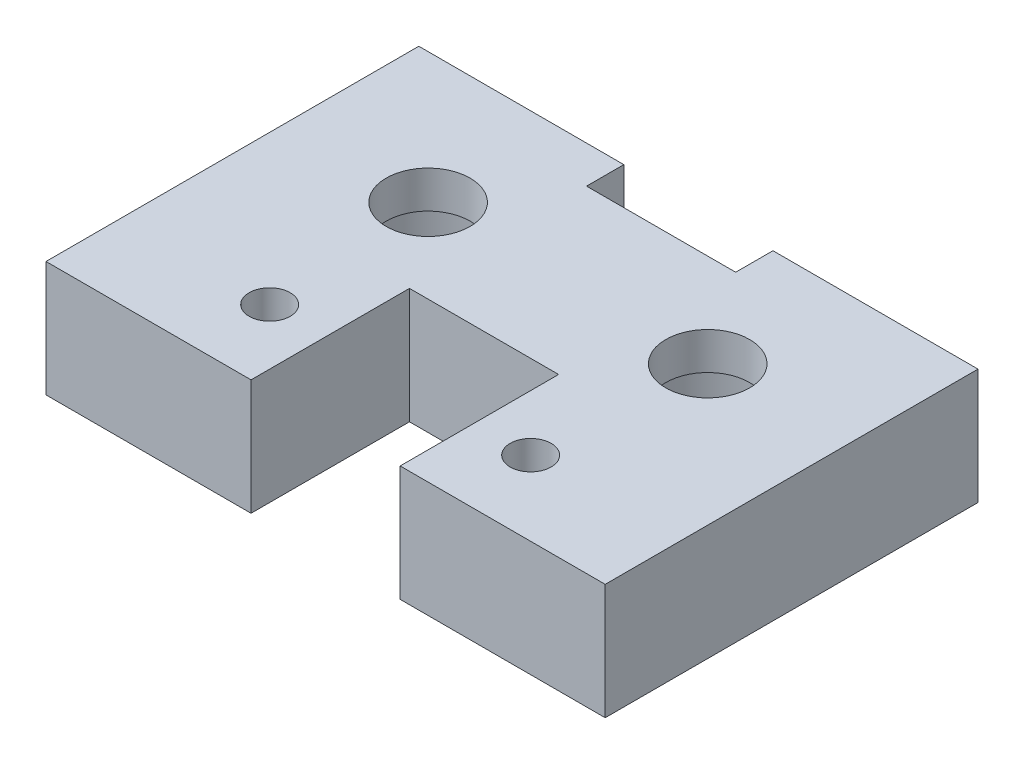
ISO-10303-21;
HEADER;
FILE_DESCRIPTION(('STEP AP214'),'2;1');
FILE_NAME('part.step','',(''),(''),'','','');
FILE_SCHEMA(('AUTOMOTIVE_DESIGN { 1 0 10303 214 1 1 1 1 }'));
ENDSEC;
DATA;
#1=APPLICATION_CONTEXT('core data for automotive mechanical design processes');
#2=APPLICATION_PROTOCOL_DEFINITION('international standard','automotive_design',2000,#1);
#3=PRODUCT_CONTEXT('',#1,'mechanical');
#4=PRODUCT('Part','Part','',(#3));
#5=PRODUCT_RELATED_PRODUCT_CATEGORY('part','',(#4));
#6=PRODUCT_DEFINITION_FORMATION('','',#4);
#7=PRODUCT_DEFINITION_CONTEXT('part definition',#1,'design');
#8=PRODUCT_DEFINITION('design','',#6,#7);
#9=PRODUCT_DEFINITION_SHAPE('','',#8);
#10=(LENGTH_UNIT() NAMED_UNIT(*) SI_UNIT(.MILLI.,.METRE.));
#11=(NAMED_UNIT(*) PLANE_ANGLE_UNIT() SI_UNIT($,.RADIAN.));
#12=(NAMED_UNIT(*) SI_UNIT($,.STERADIAN.) SOLID_ANGLE_UNIT());
#13=UNCERTAINTY_MEASURE_WITH_UNIT(LENGTH_MEASURE(1.E-05),#10,'distance_accuracy_value','');
#14=(GEOMETRIC_REPRESENTATION_CONTEXT(3) GLOBAL_UNCERTAINTY_ASSIGNED_CONTEXT((#13)) GLOBAL_UNIT_ASSIGNED_CONTEXT((#10,
#11,#12)) REPRESENTATION_CONTEXT('',''));
#15=CARTESIAN_POINT('',(0.,0.,0.));
#16=DIRECTION('',(0.,0.,1.));
#17=DIRECTION('',(1.,0.,0.));
#18=AXIS2_PLACEMENT_3D('',#15,#16,#17);
#19=CARTESIAN_POINT('',(0.,0.,0.));
#20=DIRECTION('',(0.,-1.,0.));
#21=DIRECTION('',(0.,0.,-1.));
#22=AXIS2_PLACEMENT_3D('',#19,#20,#21);
#23=PLANE('',#22);
#24=CARTESIAN_POINT('',(-7.,0.,6.));
#25=DIRECTION('',(0.,1.,0.));
#26=DIRECTION('',(0.,0.,1.));
#27=AXIS2_PLACEMENT_3D('',#24,#25,#26);
#28=CIRCLE('',#27,1.1);
#29=CARTESIAN_POINT('',(-7.,0.,7.1));
#30=VERTEX_POINT('',#29);
#31=EDGE_CURVE('E182',#30,#30,#28,.T.);
#32=ORIENTED_EDGE('',*,*,#31,.T.);
#33=EDGE_LOOP('',(#32));
#34=FACE_BOUND('',#33,.T.);
#35=CARTESIAN_POINT('',(7.,0.,6.));
#36=DIRECTION('',(0.,1.,0.));
#37=DIRECTION('',(0.,0.,-1.));
#38=AXIS2_PLACEMENT_3D('',#35,#36,#37);
#39=CIRCLE('',#38,1.1);
#40=CARTESIAN_POINT('',(7.,0.,4.9));
#41=VERTEX_POINT('',#40);
#42=EDGE_CURVE('E177',#41,#41,#39,.T.);
#43=ORIENTED_EDGE('',*,*,#42,.T.);
#44=EDGE_LOOP('',(#43));
#45=FACE_BOUND('',#44,.T.);
#46=DIRECTION('',(0.,0.,-1.));
#47=VECTOR('',#46,1.);
#48=CARTESIAN_POINT('',(4.,0.,-8.));
#49=LINE('',#48,#47);
#50=CARTESIAN_POINT('',(4.,0.,-8.));
#51=VERTEX_POINT('',#50);
#52=CARTESIAN_POINT('',(4.,0.,-10.));
#53=VERTEX_POINT('',#52);
#54=EDGE_CURVE('E191',#51,#53,#49,.T.);
#55=ORIENTED_EDGE('',*,*,#54,.T.);
#56=DIRECTION('',(-1.,0.,0.));
#57=VECTOR('',#56,1.);
#58=CARTESIAN_POINT('',(-15.,0.,-10.));
#59=LINE('',#58,#57);
#60=CARTESIAN_POINT('',(15.,0.,-10.));
#61=VERTEX_POINT('',#60);
#62=EDGE_CURVE('E284',#61,#53,#59,.T.);
#63=ORIENTED_EDGE('',*,*,#62,.F.);
#64=DIRECTION('',(0.,0.,-1.));
#65=VECTOR('',#64,1.);
#66=CARTESIAN_POINT('',(15.,0.,10.));
#67=LINE('',#66,#65);
#68=CARTESIAN_POINT('',(15.,0.,10.));
#69=VERTEX_POINT('',#68);
#70=EDGE_CURVE('E274',#69,#61,#67,.T.);
#71=ORIENTED_EDGE('',*,*,#70,.F.);
#72=DIRECTION('',(1.,0.,0.));
#73=VECTOR('',#72,1.);
#74=CARTESIAN_POINT('',(-15.,0.,10.));
#75=LINE('',#74,#73);
#76=CARTESIAN_POINT('',(4.,0.,10.));
#77=VERTEX_POINT('',#76);
#78=EDGE_CURVE('E289',#77,#69,#75,.T.);
#79=ORIENTED_EDGE('',*,*,#78,.F.);
#80=DIRECTION('',(0.,0.,-1.));
#81=VECTOR('',#80,1.);
#82=CARTESIAN_POINT('',(4.,0.,1.5));
#83=LINE('',#82,#81);
#84=CARTESIAN_POINT('',(4.,0.,1.5));
#85=VERTEX_POINT('',#84);
#86=EDGE_CURVE('E252',#77,#85,#83,.T.);
#87=ORIENTED_EDGE('',*,*,#86,.T.);
#88=DIRECTION('',(-1.,0.,0.));
#89=VECTOR('',#88,1.);
#90=CARTESIAN_POINT('',(-4.,0.,1.5));
#91=LINE('',#90,#89);
#92=CARTESIAN_POINT('',(-4.,0.,1.5));
#93=VERTEX_POINT('',#92);
#94=EDGE_CURVE('E255',#85,#93,#91,.T.);
#95=ORIENTED_EDGE('',*,*,#94,.T.);
#96=DIRECTION('',(0.,0.,1.));
#97=VECTOR('',#96,1.);
#98=CARTESIAN_POINT('',(-4.,0.,1.5));
#99=LINE('',#98,#97);
#100=CARTESIAN_POINT('',(-4.,0.,10.));
#101=VERTEX_POINT('',#100);
#102=EDGE_CURVE('E259',#93,#101,#99,.T.);
#103=ORIENTED_EDGE('',*,*,#102,.T.);
#104=CARTESIAN_POINT('',(-15.,0.,10.));
#105=VERTEX_POINT('',#104);
#106=EDGE_CURVE('E290',#105,#101,#75,.T.);
#107=ORIENTED_EDGE('',*,*,#106,.F.);
#108=DIRECTION('',(0.,0.,1.));
#109=VECTOR('',#108,1.);
#110=CARTESIAN_POINT('',(-15.,0.,10.));
#111=LINE('',#110,#109);
#112=CARTESIAN_POINT('',(-15.,0.,-10.));
#113=VERTEX_POINT('',#112);
#114=EDGE_CURVE('E287',#113,#105,#111,.T.);
#115=ORIENTED_EDGE('',*,*,#114,.F.);
#116=CARTESIAN_POINT('',(-4.,0.,-10.));
#117=VERTEX_POINT('',#116);
#118=EDGE_CURVE('E283',#117,#113,#59,.T.);
#119=ORIENTED_EDGE('',*,*,#118,.F.);
#120=DIRECTION('',(0.,0.,1.));
#121=VECTOR('',#120,1.);
#122=CARTESIAN_POINT('',(-4.,0.,-8.));
#123=LINE('',#122,#121);
#124=CARTESIAN_POINT('',(-4.,0.,-8.));
#125=VERTEX_POINT('',#124);
#126=EDGE_CURVE('E194',#117,#125,#123,.T.);
#127=ORIENTED_EDGE('',*,*,#126,.T.);
#128=DIRECTION('',(1.,0.,0.));
#129=VECTOR('',#128,1.);
#130=CARTESIAN_POINT('',(-4.,0.,-8.));
#131=LINE('',#130,#129);
#132=EDGE_CURVE('E198',#125,#51,#131,.T.);
#133=ORIENTED_EDGE('',*,*,#132,.T.);
#134=EDGE_LOOP('',(#55,#63,#71,#79,#87,#95,#103,#107,#115,#119,#127,#133));
#135=FACE_BOUND('',#134,.T.);
#136=CARTESIAN_POINT('',(-7.5,0.,-3.));
#137=DIRECTION('',(0.,1.,0.));
#138=DIRECTION('',(0.,0.,1.));
#139=AXIS2_PLACEMENT_3D('',#136,#137,#138);
#140=CIRCLE('',#139,4.15);
#141=CARTESIAN_POINT('',(-7.5,0.,1.15));
#142=VERTEX_POINT('',#141);
#143=EDGE_CURVE('E271',#142,#142,#140,.T.);
#144=ORIENTED_EDGE('',*,*,#143,.T.);
#145=EDGE_LOOP('',(#144));
#146=FACE_BOUND('',#145,.T.);
#147=CARTESIAN_POINT('',(7.5,0.,-3.));
#148=DIRECTION('',(0.,1.,0.));
#149=DIRECTION('',(0.,0.,1.));
#150=AXIS2_PLACEMENT_3D('',#147,#148,#149);
#151=CIRCLE('',#150,4.15);
#152=CARTESIAN_POINT('',(7.5,0.,1.15));
#153=VERTEX_POINT('',#152);
#154=EDGE_CURVE('E265',#153,#153,#151,.T.);
#155=ORIENTED_EDGE('',*,*,#154,.T.);
#156=EDGE_LOOP('',(#155));
#157=FACE_BOUND('',#156,.T.);
#158=DIRECTION('',(1.,0.,0.));
#159=VECTOR('',#158,1.);
#160=CARTESIAN_POINT('',(1.4,0.,-6.4));
#161=LINE('',#160,#159);
#162=CARTESIAN_POINT('',(-1.4,0.,-6.4));
#163=VERTEX_POINT('',#162);
#164=CARTESIAN_POINT('',(1.4,0.,-6.4));
#165=VERTEX_POINT('',#164);
#166=EDGE_CURVE('E417',#163,#165,#161,.T.);
#167=ORIENTED_EDGE('',*,*,#166,.F.);
#168=DIRECTION('',(0.,0.,-1.));
#169=VECTOR('',#168,1.);
#170=CARTESIAN_POINT('',(-1.4,0.,-3.6));
#171=LINE('',#170,#169);
#172=CARTESIAN_POINT('',(-1.4,0.,-3.6));
#173=VERTEX_POINT('',#172);
#174=EDGE_CURVE('E172',#173,#163,#171,.T.);
#175=ORIENTED_EDGE('',*,*,#174,.F.);
#176=DIRECTION('',(-1.,0.,0.));
#177=VECTOR('',#176,1.);
#178=CARTESIAN_POINT('',(1.4,0.,-3.6));
#179=LINE('',#178,#177);
#180=CARTESIAN_POINT('',(1.4,0.,-3.6));
#181=VERTEX_POINT('',#180);
#182=EDGE_CURVE('E168',#181,#173,#179,.T.);
#183=ORIENTED_EDGE('',*,*,#182,.F.);
#184=DIRECTION('',(0.,0.,1.));
#185=VECTOR('',#184,1.);
#186=CARTESIAN_POINT('',(1.4,0.,-3.6));
#187=LINE('',#186,#185);
#188=EDGE_CURVE('E419',#165,#181,#187,.T.);
#189=ORIENTED_EDGE('',*,*,#188,.F.);
#190=EDGE_LOOP('',(#167,#175,#183,#189));
#191=FACE_BOUND('',#190,.T.);
#192=ADVANCED_FACE('F35',(#34,#45,#135,#146,#157,#191),#23,.T.);
#193=CARTESIAN_POINT('',(-15.,4.2,-10.));
#194=DIRECTION('',(0.,0.,1.));
#195=DIRECTION('',(1.,0.,0.));
#196=AXIS2_PLACEMENT_3D('',#193,#194,#195);
#197=PLANE('',#196);
#198=ORIENTED_EDGE('',*,*,#62,.T.);
#199=DIRECTION('',(0.,1.,0.));
#200=VECTOR('',#199,1.);
#201=CARTESIAN_POINT('',(4.,0.,-10.));
#202=LINE('',#201,#200);
#203=CARTESIAN_POINT('',(4.,6.2,-10.));
#204=VERTEX_POINT('',#203);
#205=EDGE_CURVE('E201',#53,#204,#202,.T.);
#206=ORIENTED_EDGE('',*,*,#205,.T.);
#207=DIRECTION('',(-1.,0.,0.));
#208=VECTOR('',#207,1.);
#209=CARTESIAN_POINT('',(15.,6.2,-10.));
#210=LINE('',#209,#208);
#211=CARTESIAN_POINT('',(15.,6.2,-10.));
#212=VERTEX_POINT('',#211);
#213=EDGE_CURVE('E242',#212,#204,#210,.T.);
#214=ORIENTED_EDGE('',*,*,#213,.F.);
#215=DIRECTION('',(0.,-1.,0.));
#216=VECTOR('',#215,1.);
#217=CARTESIAN_POINT('',(15.,4.2,-10.));
#218=LINE('',#217,#216);
#219=EDGE_CURVE('E11',#212,#61,#218,.T.);
#220=ORIENTED_EDGE('',*,*,#219,.T.);
#221=EDGE_LOOP('',(#198,#206,#214,#220));
#222=FACE_BOUND('',#221,.T.);
#223=ADVANCED_FACE('F319',(#222),#197,.F.);
#224=CARTESIAN_POINT('',(-15.,4.2,10.));
#225=DIRECTION('',(0.,0.,-1.));
#226=DIRECTION('',(-1.,0.,0.));
#227=AXIS2_PLACEMENT_3D('',#224,#225,#226);
#228=PLANE('',#227);
#229=DIRECTION('',(0.,-1.,0.));
#230=VECTOR('',#229,1.);
#231=CARTESIAN_POINT('',(15.,4.2,10.));
#232=LINE('',#231,#230);
#233=CARTESIAN_POINT('',(15.,6.2,10.));
#234=VERTEX_POINT('',#233);
#235=EDGE_CURVE('E293',#234,#69,#232,.T.);
#236=ORIENTED_EDGE('',*,*,#235,.F.);
#237=DIRECTION('',(1.,0.,0.));
#238=VECTOR('',#237,1.);
#239=CARTESIAN_POINT('',(4.,6.2,10.));
#240=LINE('',#239,#238);
#241=CARTESIAN_POINT('',(4.,6.2,10.));
#242=VERTEX_POINT('',#241);
#243=EDGE_CURVE('E235',#242,#234,#240,.T.);
#244=ORIENTED_EDGE('',*,*,#243,.F.);
#245=DIRECTION('',(0.,1.,0.));
#246=VECTOR('',#245,1.);
#247=CARTESIAN_POINT('',(4.,0.,10.));
#248=LINE('',#247,#246);
#249=EDGE_CURVE('E263',#77,#242,#248,.T.);
#250=ORIENTED_EDGE('',*,*,#249,.F.);
#251=ORIENTED_EDGE('',*,*,#78,.T.);
#252=EDGE_LOOP('',(#236,#244,#250,#251));
#253=FACE_BOUND('',#252,.T.);
#254=ADVANCED_FACE('F325',(#253),#228,.F.);
#255=CARTESIAN_POINT('',(15.,4.2,10.));
#256=DIRECTION('',(-1.,0.,0.));
#257=DIRECTION('',(0.,0.,1.));
#258=AXIS2_PLACEMENT_3D('',#255,#256,#257);
#259=PLANE('',#258);
#260=ORIENTED_EDGE('',*,*,#70,.T.);
#261=ORIENTED_EDGE('',*,*,#219,.F.);
#262=DIRECTION('',(0.,0.,-1.));
#263=VECTOR('',#262,1.);
#264=CARTESIAN_POINT('',(15.,6.2,10.));
#265=LINE('',#264,#263);
#266=EDGE_CURVE('E238',#234,#212,#265,.T.);
#267=ORIENTED_EDGE('',*,*,#266,.F.);
#268=ORIENTED_EDGE('',*,*,#235,.T.);
#269=EDGE_LOOP('',(#260,#261,#267,#268));
#270=FACE_BOUND('',#269,.T.);
#271=ADVANCED_FACE('F37',(#270),#259,.F.);
#272=CARTESIAN_POINT('',(-4.,6.2,-10.));
#273=VERTEX_POINT('',#272);
#274=CARTESIAN_POINT('',(-15.,6.2,-10.));
#275=VERTEX_POINT('',#274);
#276=EDGE_CURVE('E241',#273,#275,#210,.T.);
#277=ORIENTED_EDGE('',*,*,#276,.F.);
#278=DIRECTION('',(0.,1.,0.));
#279=VECTOR('',#278,1.);
#280=CARTESIAN_POINT('',(-4.,0.,-10.));
#281=LINE('',#280,#279);
#282=EDGE_CURVE('E58',#117,#273,#281,.T.);
#283=ORIENTED_EDGE('',*,*,#282,.F.);
#284=ORIENTED_EDGE('',*,*,#118,.T.);
#285=DIRECTION('',(0.,-1.,0.));
#286=VECTOR('',#285,1.);
#287=CARTESIAN_POINT('',(-15.,4.2,-10.));
#288=LINE('',#287,#286);
#289=EDGE_CURVE('E43',#275,#113,#288,.T.);
#290=ORIENTED_EDGE('',*,*,#289,.F.);
#291=EDGE_LOOP('',(#277,#283,#284,#290));
#292=FACE_BOUND('',#291,.T.);
#293=ADVANCED_FACE('F317',(#292),#197,.F.);
#294=CARTESIAN_POINT('',(-15.,4.2,10.));
#295=DIRECTION('',(1.,0.,0.));
#296=DIRECTION('',(0.,0.,-1.));
#297=AXIS2_PLACEMENT_3D('',#294,#295,#296);
#298=PLANE('',#297);
#299=ORIENTED_EDGE('',*,*,#114,.T.);
#300=DIRECTION('',(0.,-1.,0.));
#301=VECTOR('',#300,1.);
#302=CARTESIAN_POINT('',(-15.,4.2,10.));
#303=LINE('',#302,#301);
#304=CARTESIAN_POINT('',(-15.,6.2,10.));
#305=VERTEX_POINT('',#304);
#306=EDGE_CURVE('E296',#305,#105,#303,.T.);
#307=ORIENTED_EDGE('',*,*,#306,.F.);
#308=DIRECTION('',(0.,0.,1.));
#309=VECTOR('',#308,1.);
#310=CARTESIAN_POINT('',(-15.,6.2,-10.));
#311=LINE('',#310,#309);
#312=EDGE_CURVE('E245',#275,#305,#311,.T.);
#313=ORIENTED_EDGE('',*,*,#312,.F.);
#314=ORIENTED_EDGE('',*,*,#289,.T.);
#315=EDGE_LOOP('',(#299,#307,#313,#314));
#316=FACE_BOUND('',#315,.T.);
#317=ADVANCED_FACE('F303',(#316),#298,.F.);
#318=ORIENTED_EDGE('',*,*,#106,.T.);
#319=DIRECTION('',(0.,1.,0.));
#320=VECTOR('',#319,1.);
#321=CARTESIAN_POINT('',(-4.,0.,10.));
#322=LINE('',#321,#320);
#323=CARTESIAN_POINT('',(-4.,6.2,10.));
#324=VERTEX_POINT('',#323);
#325=EDGE_CURVE('E266',#101,#324,#322,.T.);
#326=ORIENTED_EDGE('',*,*,#325,.T.);
#327=DIRECTION('',(1.,0.,0.));
#328=VECTOR('',#327,1.);
#329=CARTESIAN_POINT('',(-15.,6.2,10.));
#330=LINE('',#329,#328);
#331=EDGE_CURVE('E248',#305,#324,#330,.T.);
#332=ORIENTED_EDGE('',*,*,#331,.F.);
#333=ORIENTED_EDGE('',*,*,#306,.T.);
#334=EDGE_LOOP('',(#318,#326,#332,#333));
#335=FACE_BOUND('',#334,.T.);
#336=ADVANCED_FACE('F311',(#335),#228,.F.);
#337=CARTESIAN_POINT('',(7.5,0.,-3.));
#338=DIRECTION('',(0.,1.,0.));
#339=DIRECTION('',(0.,0.,1.));
#340=AXIS2_PLACEMENT_3D('',#337,#338,#339);
#341=CYLINDRICAL_SURFACE('',#340,4.15);
#342=ORIENTED_EDGE('',*,*,#154,.F.);
#343=EDGE_LOOP('',(#342));
#344=FACE_BOUND('',#343,.T.);
#345=CARTESIAN_POINT('',(7.5,4.2,-3.));
#346=DIRECTION('',(0.,1.,0.));
#347=DIRECTION('',(0.,0.,1.));
#348=AXIS2_PLACEMENT_3D('',#345,#346,#347);
#349=CIRCLE('',#348,4.15);
#350=CARTESIAN_POINT('',(7.5,4.2,1.15));
#351=VERTEX_POINT('',#350);
#352=EDGE_CURVE('E251',#351,#351,#349,.T.);
#353=ORIENTED_EDGE('',*,*,#352,.T.);
#354=EDGE_LOOP('',(#353));
#355=FACE_BOUND('',#354,.T.);
#356=ADVANCED_FACE('F337',(#344,#355),#341,.F.);
#357=CARTESIAN_POINT('',(-7.5,0.,-3.));
#358=DIRECTION('',(0.,1.,0.));
#359=DIRECTION('',(0.,0.,1.));
#360=AXIS2_PLACEMENT_3D('',#357,#358,#359);
#361=CYLINDRICAL_SURFACE('',#360,4.15);
#362=ORIENTED_EDGE('',*,*,#143,.F.);
#363=EDGE_LOOP('',(#362));
#364=FACE_BOUND('',#363,.T.);
#365=CARTESIAN_POINT('',(-7.5,4.2,-3.));
#366=DIRECTION('',(0.,1.,0.));
#367=DIRECTION('',(0.,0.,1.));
#368=AXIS2_PLACEMENT_3D('',#365,#366,#367);
#369=CIRCLE('',#368,4.15);
#370=CARTESIAN_POINT('',(-7.5,4.2,1.15));
#371=VERTEX_POINT('',#370);
#372=EDGE_CURVE('E256',#371,#371,#369,.T.);
#373=ORIENTED_EDGE('',*,*,#372,.T.);
#374=EDGE_LOOP('',(#373));
#375=FACE_BOUND('',#374,.T.);
#376=ADVANCED_FACE('F343',(#364,#375),#361,.F.);
#377=CARTESIAN_POINT('',(4.,0.,1.5));
#378=DIRECTION('',(1.,0.,0.));
#379=DIRECTION('',(0.,0.,-1.));
#380=AXIS2_PLACEMENT_3D('',#377,#378,#379);
#381=PLANE('',#380);
#382=ORIENTED_EDGE('',*,*,#249,.T.);
#383=DIRECTION('',(0.,0.,1.));
#384=VECTOR('',#383,1.);
#385=CARTESIAN_POINT('',(4.,6.2,1.5));
#386=LINE('',#385,#384);
#387=CARTESIAN_POINT('',(4.,6.2,1.5));
#388=VERTEX_POINT('',#387);
#389=EDGE_CURVE('E232',#388,#242,#386,.T.);
#390=ORIENTED_EDGE('',*,*,#389,.F.);
#391=DIRECTION('',(0.,1.,0.));
#392=VECTOR('',#391,1.);
#393=CARTESIAN_POINT('',(4.,0.,1.5));
#394=LINE('',#393,#392);
#395=EDGE_CURVE('E262',#85,#388,#394,.T.);
#396=ORIENTED_EDGE('',*,*,#395,.F.);
#397=ORIENTED_EDGE('',*,*,#86,.F.);
#398=EDGE_LOOP('',(#382,#390,#396,#397));
#399=FACE_BOUND('',#398,.T.);
#400=ADVANCED_FACE('F398',(#399),#381,.F.);
#401=CARTESIAN_POINT('',(-4.,0.,1.5));
#402=DIRECTION('',(-1.,0.,0.));
#403=DIRECTION('',(0.,0.,1.));
#404=AXIS2_PLACEMENT_3D('',#401,#402,#403);
#405=PLANE('',#404);
#406=DIRECTION('',(0.,1.,0.));
#407=VECTOR('',#406,1.);
#408=CARTESIAN_POINT('',(-4.,0.,1.5));
#409=LINE('',#408,#407);
#410=CARTESIAN_POINT('',(-4.,6.2,1.5));
#411=VERTEX_POINT('',#410);
#412=EDGE_CURVE('E268',#93,#411,#409,.T.);
#413=ORIENTED_EDGE('',*,*,#412,.T.);
#414=DIRECTION('',(0.,0.,-1.));
#415=VECTOR('',#414,1.);
#416=CARTESIAN_POINT('',(-4.,6.2,10.));
#417=LINE('',#416,#415);
#418=EDGE_CURVE('E218',#324,#411,#417,.T.);
#419=ORIENTED_EDGE('',*,*,#418,.F.);
#420=ORIENTED_EDGE('',*,*,#325,.F.);
#421=ORIENTED_EDGE('',*,*,#102,.F.);
#422=EDGE_LOOP('',(#413,#419,#420,#421));
#423=FACE_BOUND('',#422,.T.);
#424=ADVANCED_FACE('F394',(#423),#405,.F.);
#425=CARTESIAN_POINT('',(-4.,0.,1.5));
#426=DIRECTION('',(0.,0.,-1.));
#427=DIRECTION('',(-1.,0.,0.));
#428=AXIS2_PLACEMENT_3D('',#425,#426,#427);
#429=PLANE('',#428);
#430=ORIENTED_EDGE('',*,*,#395,.T.);
#431=DIRECTION('',(1.,0.,0.));
#432=VECTOR('',#431,1.);
#433=CARTESIAN_POINT('',(-4.,6.2,1.5));
#434=LINE('',#433,#432);
#435=EDGE_CURVE('E229',#411,#388,#434,.T.);
#436=ORIENTED_EDGE('',*,*,#435,.F.);
#437=ORIENTED_EDGE('',*,*,#412,.F.);
#438=ORIENTED_EDGE('',*,*,#94,.F.);
#439=EDGE_LOOP('',(#430,#436,#437,#438));
#440=FACE_BOUND('',#439,.T.);
#441=ADVANCED_FACE('F397',(#440),#429,.F.);
#442=CARTESIAN_POINT('',(0.,4.2,0.));
#443=DIRECTION('',(0.,-1.,0.));
#444=DIRECTION('',(0.,0.,-1.));
#445=AXIS2_PLACEMENT_3D('',#442,#443,#444);
#446=PLANE('',#445);
#447=CARTESIAN_POINT('',(7.5,4.2,-3.));
#448=DIRECTION('',(0.,-1.,0.));
#449=DIRECTION('',(0.,0.,-1.));
#450=AXIS2_PLACEMENT_3D('',#447,#448,#449);
#451=CIRCLE('',#450,2.25);
#452=CARTESIAN_POINT('',(7.5,4.2,-5.25));
#453=VERTEX_POINT('',#452);
#454=EDGE_CURVE('E209',#453,#453,#451,.T.);
#455=ORIENTED_EDGE('',*,*,#454,.F.);
#456=EDGE_LOOP('',(#455));
#457=FACE_BOUND('',#456,.T.);
#458=ORIENTED_EDGE('',*,*,#352,.F.);
#459=EDGE_LOOP('',(#458));
#460=FACE_BOUND('',#459,.T.);
#461=ADVANCED_FACE('F392',(#457,#460),#446,.T.);
#462=CARTESIAN_POINT('',(-7.5,4.2,-3.));
#463=DIRECTION('',(0.,-1.,0.));
#464=DIRECTION('',(0.,0.,-1.));
#465=AXIS2_PLACEMENT_3D('',#462,#463,#464);
#466=CIRCLE('',#465,2.25);
#467=CARTESIAN_POINT('',(-7.5,4.2,-5.25));
#468=VERTEX_POINT('',#467);
#469=EDGE_CURVE('E219',#468,#468,#466,.T.);
#470=ORIENTED_EDGE('',*,*,#469,.F.);
#471=EDGE_LOOP('',(#470));
#472=FACE_BOUND('',#471,.T.);
#473=ORIENTED_EDGE('',*,*,#372,.F.);
#474=EDGE_LOOP('',(#473));
#475=FACE_BOUND('',#474,.T.);
#476=ADVANCED_FACE('F388',(#472,#475),#446,.T.);
#477=CARTESIAN_POINT('',(0.,6.2,0.));
#478=DIRECTION('',(0.,-1.,0.));
#479=DIRECTION('',(0.,0.,-1.));
#480=AXIS2_PLACEMENT_3D('',#477,#478,#479);
#481=PLANE('',#480);
#482=CARTESIAN_POINT('',(-7.,6.2,6.));
#483=DIRECTION('',(0.,1.,0.));
#484=DIRECTION('',(0.,0.,1.));
#485=AXIS2_PLACEMENT_3D('',#482,#483,#484);
#486=CIRCLE('',#485,1.1);
#487=CARTESIAN_POINT('',(-7.,6.2,7.1));
#488=VERTEX_POINT('',#487);
#489=EDGE_CURVE('E186',#488,#488,#486,.T.);
#490=ORIENTED_EDGE('',*,*,#489,.F.);
#491=EDGE_LOOP('',(#490));
#492=FACE_BOUND('',#491,.T.);
#493=CARTESIAN_POINT('',(7.,6.2,6.));
#494=DIRECTION('',(0.,1.,0.));
#495=DIRECTION('',(0.,0.,-1.));
#496=AXIS2_PLACEMENT_3D('',#493,#494,#495);
#497=CIRCLE('',#496,1.1);
#498=CARTESIAN_POINT('',(7.,6.2,4.9));
#499=VERTEX_POINT('',#498);
#500=EDGE_CURVE('E174',#499,#499,#497,.T.);
#501=ORIENTED_EDGE('',*,*,#500,.F.);
#502=EDGE_LOOP('',(#501));
#503=FACE_BOUND('',#502,.T.);
#504=CARTESIAN_POINT('',(-7.5,6.2,-3.));
#505=DIRECTION('',(0.,-1.,0.));
#506=DIRECTION('',(0.,0.,-1.));
#507=AXIS2_PLACEMENT_3D('',#504,#505,#506);
#508=CIRCLE('',#507,2.25);
#509=CARTESIAN_POINT('',(-7.5,6.2,-5.25));
#510=VERTEX_POINT('',#509);
#511=EDGE_CURVE('E215',#510,#510,#508,.T.);
#512=ORIENTED_EDGE('',*,*,#511,.T.);
#513=EDGE_LOOP('',(#512));
#514=FACE_BOUND('',#513,.T.);
#515=CARTESIAN_POINT('',(7.5,6.2,-3.));
#516=DIRECTION('',(0.,-1.,0.));
#517=DIRECTION('',(0.,0.,-1.));
#518=AXIS2_PLACEMENT_3D('',#515,#516,#517);
#519=CIRCLE('',#518,2.25);
#520=CARTESIAN_POINT('',(7.5,6.2,-5.25));
#521=VERTEX_POINT('',#520);
#522=EDGE_CURVE('E222',#521,#521,#519,.T.);
#523=ORIENTED_EDGE('',*,*,#522,.T.);
#524=EDGE_LOOP('',(#523));
#525=FACE_BOUND('',#524,.T.);
#526=ORIENTED_EDGE('',*,*,#213,.T.);
#527=DIRECTION('',(0.,0.,-1.));
#528=VECTOR('',#527,1.);
#529=CARTESIAN_POINT('',(4.,6.2,-8.));
#530=LINE('',#529,#528);
#531=CARTESIAN_POINT('',(4.,6.2,-8.));
#532=VERTEX_POINT('',#531);
#533=EDGE_CURVE('E185',#532,#204,#530,.T.);
#534=ORIENTED_EDGE('',*,*,#533,.F.);
#535=DIRECTION('',(1.,0.,0.));
#536=VECTOR('',#535,1.);
#537=CARTESIAN_POINT('',(-4.,6.2,-8.));
#538=LINE('',#537,#536);
#539=CARTESIAN_POINT('',(-4.,6.2,-8.));
#540=VERTEX_POINT('',#539);
#541=EDGE_CURVE('E195',#540,#532,#538,.T.);
#542=ORIENTED_EDGE('',*,*,#541,.F.);
#543=DIRECTION('',(0.,0.,1.));
#544=VECTOR('',#543,1.);
#545=CARTESIAN_POINT('',(-4.,6.2,-8.));
#546=LINE('',#545,#544);
#547=EDGE_CURVE('E203',#273,#540,#546,.T.);
#548=ORIENTED_EDGE('',*,*,#547,.F.);
#549=ORIENTED_EDGE('',*,*,#276,.T.);
#550=ORIENTED_EDGE('',*,*,#312,.T.);
#551=ORIENTED_EDGE('',*,*,#331,.T.);
#552=ORIENTED_EDGE('',*,*,#418,.T.);
#553=ORIENTED_EDGE('',*,*,#435,.T.);
#554=ORIENTED_EDGE('',*,*,#389,.T.);
#555=ORIENTED_EDGE('',*,*,#243,.T.);
#556=ORIENTED_EDGE('',*,*,#266,.T.);
#557=EDGE_LOOP('',(#526,#534,#542,#548,#549,#550,#551,#552,#553,#554,#555,#556));
#558=FACE_BOUND('',#557,.T.);
#559=ADVANCED_FACE('F314',(#492,#503,#514,#525,#558),#481,.F.);
#560=CARTESIAN_POINT('',(7.5,6.2,-3.));
#561=DIRECTION('',(0.,-1.,0.));
#562=DIRECTION('',(0.,0.,-1.));
#563=AXIS2_PLACEMENT_3D('',#560,#561,#562);
#564=CYLINDRICAL_SURFACE('',#563,2.25);
#565=ORIENTED_EDGE('',*,*,#522,.F.);
#566=EDGE_LOOP('',(#565));
#567=FACE_BOUND('',#566,.T.);
#568=ORIENTED_EDGE('',*,*,#454,.T.);
#569=EDGE_LOOP('',(#568));
#570=FACE_BOUND('',#569,.T.);
#571=ADVANCED_FACE('F381',(#567,#570),#564,.F.);
#572=CARTESIAN_POINT('',(-7.5,6.2,-3.));
#573=DIRECTION('',(0.,-1.,0.));
#574=DIRECTION('',(0.,0.,-1.));
#575=AXIS2_PLACEMENT_3D('',#572,#573,#574);
#576=CYLINDRICAL_SURFACE('',#575,2.25);
#577=ORIENTED_EDGE('',*,*,#511,.F.);
#578=EDGE_LOOP('',(#577));
#579=FACE_BOUND('',#578,.T.);
#580=ORIENTED_EDGE('',*,*,#469,.T.);
#581=EDGE_LOOP('',(#580));
#582=FACE_BOUND('',#581,.T.);
#583=ADVANCED_FACE('F378',(#579,#582),#576,.F.);
#584=CARTESIAN_POINT('',(4.,0.,-8.));
#585=DIRECTION('',(1.,0.,0.));
#586=DIRECTION('',(0.,0.,-1.));
#587=AXIS2_PLACEMENT_3D('',#584,#585,#586);
#588=PLANE('',#587);
#589=ORIENTED_EDGE('',*,*,#533,.T.);
#590=ORIENTED_EDGE('',*,*,#205,.F.);
#591=ORIENTED_EDGE('',*,*,#54,.F.);
#592=DIRECTION('',(0.,1.,0.));
#593=VECTOR('',#592,1.);
#594=CARTESIAN_POINT('',(4.,0.,-8.));
#595=LINE('',#594,#593);
#596=EDGE_CURVE('E207',#51,#532,#595,.T.);
#597=ORIENTED_EDGE('',*,*,#596,.T.);
#598=EDGE_LOOP('',(#589,#590,#591,#597));
#599=FACE_BOUND('',#598,.T.);
#600=ADVANCED_FACE('F358',(#599),#588,.F.);
#601=CARTESIAN_POINT('',(-4.,0.,-8.));
#602=DIRECTION('',(0.,0.,1.));
#603=DIRECTION('',(1.,0.,0.));
#604=AXIS2_PLACEMENT_3D('',#601,#602,#603);
#605=PLANE('',#604);
#606=ORIENTED_EDGE('',*,*,#541,.T.);
#607=ORIENTED_EDGE('',*,*,#596,.F.);
#608=ORIENTED_EDGE('',*,*,#132,.F.);
#609=DIRECTION('',(0.,1.,0.));
#610=VECTOR('',#609,1.);
#611=CARTESIAN_POINT('',(-4.,0.,-8.));
#612=LINE('',#611,#610);
#613=EDGE_CURVE('E210',#125,#540,#612,.T.);
#614=ORIENTED_EDGE('',*,*,#613,.T.);
#615=EDGE_LOOP('',(#606,#607,#608,#614));
#616=FACE_BOUND('',#615,.T.);
#617=ADVANCED_FACE('F362',(#616),#605,.F.);
#618=CARTESIAN_POINT('',(-4.,0.,-8.));
#619=DIRECTION('',(-1.,0.,0.));
#620=DIRECTION('',(0.,0.,1.));
#621=AXIS2_PLACEMENT_3D('',#618,#619,#620);
#622=PLANE('',#621);
#623=ORIENTED_EDGE('',*,*,#547,.T.);
#624=ORIENTED_EDGE('',*,*,#613,.F.);
#625=ORIENTED_EDGE('',*,*,#126,.F.);
#626=ORIENTED_EDGE('',*,*,#282,.T.);
#627=EDGE_LOOP('',(#623,#624,#625,#626));
#628=FACE_BOUND('',#627,.T.);
#629=ADVANCED_FACE('F363',(#628),#622,.F.);
#630=CARTESIAN_POINT('',(7.,0.,6.));
#631=DIRECTION('',(0.,1.,0.));
#632=DIRECTION('',(0.,0.,1.));
#633=AXIS2_PLACEMENT_3D('',#630,#631,#632);
#634=CYLINDRICAL_SURFACE('',#633,1.1);
#635=ORIENTED_EDGE('',*,*,#42,.F.);
#636=EDGE_LOOP('',(#635));
#637=FACE_BOUND('',#636,.T.);
#638=ORIENTED_EDGE('',*,*,#500,.T.);
#639=EDGE_LOOP('',(#638));
#640=FACE_BOUND('',#639,.T.);
#641=ADVANCED_FACE('F365',(#637,#640),#634,.F.);
#642=CARTESIAN_POINT('',(-7.,0.,6.));
#643=DIRECTION('',(0.,1.,0.));
#644=DIRECTION('',(0.,0.,1.));
#645=AXIS2_PLACEMENT_3D('',#642,#643,#644);
#646=CYLINDRICAL_SURFACE('',#645,1.1);
#647=ORIENTED_EDGE('',*,*,#31,.F.);
#648=EDGE_LOOP('',(#647));
#649=FACE_BOUND('',#648,.T.);
#650=ORIENTED_EDGE('',*,*,#489,.T.);
#651=EDGE_LOOP('',(#650));
#652=FACE_BOUND('',#651,.T.);
#653=ADVANCED_FACE('F371',(#649,#652),#646,.F.);
#654=CARTESIAN_POINT('',(-1.4,-3.,-3.6));
#655=DIRECTION('',(1.,0.,0.));
#656=DIRECTION('',(0.,0.,-1.));
#657=AXIS2_PLACEMENT_3D('',#654,#655,#656);
#658=PLANE('',#657);
#659=ORIENTED_EDGE('',*,*,#174,.T.);
#660=DIRECTION('',(0.,1.,0.));
#661=VECTOR('',#660,1.);
#662=CARTESIAN_POINT('',(-1.4,-3.,-6.4));
#663=LINE('',#662,#661);
#664=CARTESIAN_POINT('',(-1.4,-3.,-6.4));
#665=VERTEX_POINT('',#664);
#666=EDGE_CURVE('E153',#665,#163,#663,.T.);
#667=ORIENTED_EDGE('',*,*,#666,.F.);
#668=DIRECTION('',(0.,0.,-1.));
#669=VECTOR('',#668,1.);
#670=CARTESIAN_POINT('',(-1.4,-3.,-3.6));
#671=LINE('',#670,#669);
#672=CARTESIAN_POINT('',(-1.4,-3.,-3.6));
#673=VERTEX_POINT('',#672);
#674=EDGE_CURVE('E160',#673,#665,#671,.T.);
#675=ORIENTED_EDGE('',*,*,#674,.F.);
#676=DIRECTION('',(0.,1.,0.));
#677=VECTOR('',#676,1.);
#678=CARTESIAN_POINT('',(-1.4,-3.,-3.6));
#679=LINE('',#678,#677);
#680=EDGE_CURVE('E426',#673,#173,#679,.T.);
#681=ORIENTED_EDGE('',*,*,#680,.T.);
#682=EDGE_LOOP('',(#659,#667,#675,#681));
#683=FACE_BOUND('',#682,.T.);
#684=ADVANCED_FACE('F170',(#683),#658,.F.);
#685=CARTESIAN_POINT('',(1.4,-3.,-6.4));
#686=DIRECTION('',(0.,0.,1.));
#687=DIRECTION('',(1.,0.,0.));
#688=AXIS2_PLACEMENT_3D('',#685,#686,#687);
#689=PLANE('',#688);
#690=ORIENTED_EDGE('',*,*,#166,.T.);
#691=DIRECTION('',(0.,1.,0.));
#692=VECTOR('',#691,1.);
#693=CARTESIAN_POINT('',(1.4,-3.,-6.4));
#694=LINE('',#693,#692);
#695=CARTESIAN_POINT('',(1.4,-3.,-6.4));
#696=VERTEX_POINT('',#695);
#697=EDGE_CURVE('E156',#696,#165,#694,.T.);
#698=ORIENTED_EDGE('',*,*,#697,.F.);
#699=DIRECTION('',(1.,0.,0.));
#700=VECTOR('',#699,1.);
#701=CARTESIAN_POINT('',(1.4,-3.,-6.4));
#702=LINE('',#701,#700);
#703=EDGE_CURVE('E149',#665,#696,#702,.T.);
#704=ORIENTED_EDGE('',*,*,#703,.F.);
#705=ORIENTED_EDGE('',*,*,#666,.T.);
#706=EDGE_LOOP('',(#690,#698,#704,#705));
#707=FACE_BOUND('',#706,.T.);
#708=ADVANCED_FACE('F151',(#707),#689,.F.);
#709=CARTESIAN_POINT('',(1.4,-3.,-3.6));
#710=DIRECTION('',(-1.,0.,0.));
#711=DIRECTION('',(0.,0.,1.));
#712=AXIS2_PLACEMENT_3D('',#709,#710,#711);
#713=PLANE('',#712);
#714=ORIENTED_EDGE('',*,*,#188,.T.);
#715=DIRECTION('',(0.,1.,0.));
#716=VECTOR('',#715,1.);
#717=CARTESIAN_POINT('',(1.4,-3.,-3.6));
#718=LINE('',#717,#716);
#719=CARTESIAN_POINT('',(1.4,-3.,-3.6));
#720=VERTEX_POINT('',#719);
#721=EDGE_CURVE('E50',#720,#181,#718,.T.);
#722=ORIENTED_EDGE('',*,*,#721,.F.);
#723=DIRECTION('',(0.,0.,1.));
#724=VECTOR('',#723,1.);
#725=CARTESIAN_POINT('',(1.4,-3.,-3.6));
#726=LINE('',#725,#724);
#727=EDGE_CURVE('E159',#696,#720,#726,.T.);
#728=ORIENTED_EDGE('',*,*,#727,.F.);
#729=ORIENTED_EDGE('',*,*,#697,.T.);
#730=EDGE_LOOP('',(#714,#722,#728,#729));
#731=FACE_BOUND('',#730,.T.);
#732=ADVANCED_FACE('F429',(#731),#713,.F.);
#733=CARTESIAN_POINT('',(1.4,-3.,-3.6));
#734=DIRECTION('',(0.,0.,-1.));
#735=DIRECTION('',(-1.,0.,0.));
#736=AXIS2_PLACEMENT_3D('',#733,#734,#735);
#737=PLANE('',#736);
#738=ORIENTED_EDGE('',*,*,#182,.T.);
#739=ORIENTED_EDGE('',*,*,#680,.F.);
#740=DIRECTION('',(-1.,0.,0.));
#741=VECTOR('',#740,1.);
#742=CARTESIAN_POINT('',(1.4,-3.,-3.6));
#743=LINE('',#742,#741);
#744=EDGE_CURVE('E164',#720,#673,#743,.T.);
#745=ORIENTED_EDGE('',*,*,#744,.F.);
#746=ORIENTED_EDGE('',*,*,#721,.T.);
#747=EDGE_LOOP('',(#738,#739,#745,#746));
#748=FACE_BOUND('',#747,.T.);
#749=ADVANCED_FACE('F430',(#748),#737,.F.);
#750=CARTESIAN_POINT('',(0.,-3.,0.));
#751=DIRECTION('',(0.,1.,0.));
#752=DIRECTION('',(0.,0.,1.));
#753=AXIS2_PLACEMENT_3D('',#750,#751,#752);
#754=PLANE('',#753);
#755=ORIENTED_EDGE('',*,*,#674,.T.);
#756=ORIENTED_EDGE('',*,*,#703,.T.);
#757=ORIENTED_EDGE('',*,*,#727,.T.);
#758=ORIENTED_EDGE('',*,*,#744,.T.);
#759=EDGE_LOOP('',(#755,#756,#757,#758));
#760=FACE_BOUND('',#759,.T.);
#761=ADVANCED_FACE('F163',(#760),#754,.F.);
#762=CLOSED_SHELL('',(#192,#223,#254,#271,#293,#317,#336,#356,#376,#400,#424,#441,#461,#476,
#559,#571,#583,#600,#617,#629,#641,#653,#684,#708,#732,#749,#761));
#763=MANIFOLD_SOLID_BREP('B2',#762);
#764=ADVANCED_BREP_SHAPE_REPRESENTATION('',(#18,#763),#14);
#765=SHAPE_DEFINITION_REPRESENTATION(#9,#764);
ENDSEC;
END-ISO-10303-21;
